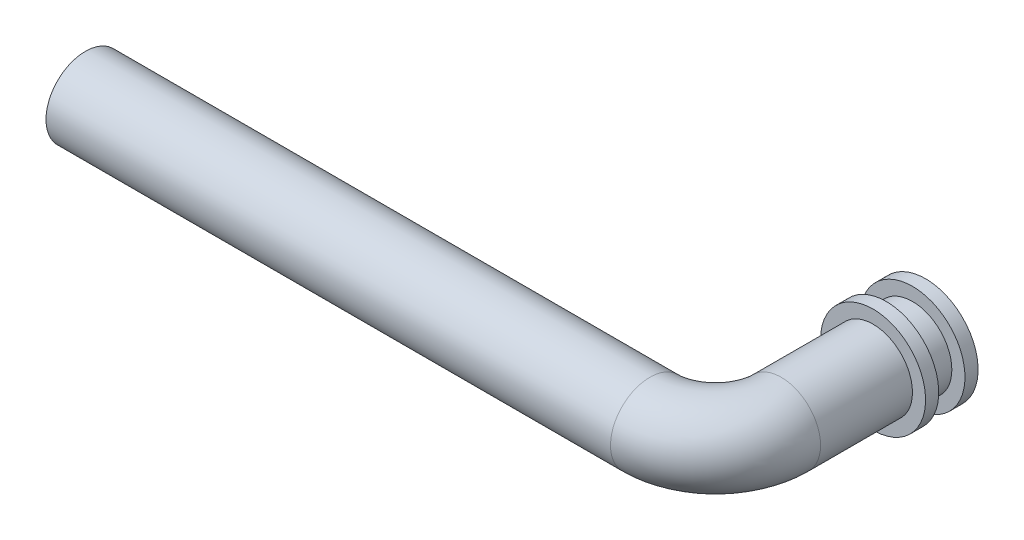
ISO-10303-21;
HEADER;
FILE_DESCRIPTION(('STEP AP214'),'2;1');
FILE_NAME('part.step','',(''),(''),'','','');
FILE_SCHEMA(('AUTOMOTIVE_DESIGN { 1 0 10303 214 1 1 1 1 }'));
ENDSEC;
DATA;
#1=APPLICATION_CONTEXT('core data for automotive mechanical design processes');
#2=APPLICATION_PROTOCOL_DEFINITION('international standard','automotive_design',2000,#1);
#3=PRODUCT_CONTEXT('',#1,'mechanical');
#4=PRODUCT('Part','Part','',(#3));
#5=PRODUCT_RELATED_PRODUCT_CATEGORY('part','',(#4));
#6=PRODUCT_DEFINITION_FORMATION('','',#4);
#7=PRODUCT_DEFINITION_CONTEXT('part definition',#1,'design');
#8=PRODUCT_DEFINITION('design','',#6,#7);
#9=PRODUCT_DEFINITION_SHAPE('','',#8);
#10=(LENGTH_UNIT() NAMED_UNIT(*) SI_UNIT(.MILLI.,.METRE.));
#11=(NAMED_UNIT(*) PLANE_ANGLE_UNIT() SI_UNIT($,.RADIAN.));
#12=(NAMED_UNIT(*) SI_UNIT($,.STERADIAN.) SOLID_ANGLE_UNIT());
#13=UNCERTAINTY_MEASURE_WITH_UNIT(LENGTH_MEASURE(1.E-05),#10,'distance_accuracy_value','');
#14=(GEOMETRIC_REPRESENTATION_CONTEXT(3) GLOBAL_UNCERTAINTY_ASSIGNED_CONTEXT((#13)) GLOBAL_UNIT_ASSIGNED_CONTEXT((#10,
#11,#12)) REPRESENTATION_CONTEXT('',''));
#15=CARTESIAN_POINT('',(0.,0.,0.));
#16=DIRECTION('',(0.,0.,1.));
#17=DIRECTION('',(1.,0.,0.));
#18=AXIS2_PLACEMENT_3D('',#15,#16,#17);
#19=CARTESIAN_POINT('',(0.,0.,0.));
#20=DIRECTION('',(0.,0.,1.));
#21=DIRECTION('',(1.,0.,0.));
#22=AXIS2_PLACEMENT_3D('',#19,#20,#21);
#23=CYLINDRICAL_SURFACE('',#22,6.);
#24=CARTESIAN_POINT('',(0.,0.,4.));
#25=DIRECTION('',(0.,0.,-1.));
#26=DIRECTION('',(-1.,0.,0.));
#27=AXIS2_PLACEMENT_3D('',#24,#25,#26);
#28=CIRCLE('',#27,6.);
#29=CARTESIAN_POINT('',(-6.,0.,4.));
#30=VERTEX_POINT('',#29);
#31=EDGE_CURVE('E13',#30,#30,#28,.F.);
#32=ORIENTED_EDGE('',*,*,#31,.F.);
#33=EDGE_LOOP('',(#32));
#34=FACE_BOUND('',#33,.T.);
#35=CARTESIAN_POINT('',(0.,0.,0.));
#36=DIRECTION('',(0.,0.,1.));
#37=DIRECTION('',(1.,0.,0.));
#38=AXIS2_PLACEMENT_3D('',#35,#36,#37);
#39=CIRCLE('',#38,6.);
#40=CARTESIAN_POINT('',(6.,0.,0.));
#41=VERTEX_POINT('',#40);
#42=EDGE_CURVE('E64',#41,#41,#39,.T.);
#43=ORIENTED_EDGE('',*,*,#42,.T.);
#44=EDGE_LOOP('',(#43));
#45=FACE_BOUND('',#44,.T.);
#46=ADVANCED_FACE('F45',(#34,#45),#23,.T.);
#47=CARTESIAN_POINT('',(0.,0.,-2.));
#48=DIRECTION('',(0.,0.,1.));
#49=DIRECTION('',(1.,0.,0.));
#50=AXIS2_PLACEMENT_3D('',#47,#48,#49);
#51=CYLINDRICAL_SURFACE('',#50,8.);
#52=CARTESIAN_POINT('',(0.,0.,-2.));
#53=DIRECTION('',(0.,0.,-1.));
#54=DIRECTION('',(-1.,0.,0.));
#55=AXIS2_PLACEMENT_3D('',#52,#53,#54);
#56=CIRCLE('',#55,8.);
#57=CARTESIAN_POINT('',(-8.,0.,-2.));
#58=VERTEX_POINT('',#57);
#59=EDGE_CURVE('E67',#58,#58,#56,.T.);
#60=ORIENTED_EDGE('',*,*,#59,.F.);
#61=EDGE_LOOP('',(#60));
#62=FACE_BOUND('',#61,.T.);
#63=CARTESIAN_POINT('',(0.,0.,0.));
#64=DIRECTION('',(0.,0.,-1.));
#65=DIRECTION('',(-1.,0.,0.));
#66=AXIS2_PLACEMENT_3D('',#63,#64,#65);
#67=CIRCLE('',#66,8.);
#68=CARTESIAN_POINT('',(-8.,0.,0.));
#69=VERTEX_POINT('',#68);
#70=EDGE_CURVE('E68',#69,#69,#67,.T.);
#71=ORIENTED_EDGE('',*,*,#70,.T.);
#72=EDGE_LOOP('',(#71));
#73=FACE_BOUND('',#72,.T.);
#74=ADVANCED_FACE('F99',(#62,#73),#51,.T.);
#75=CARTESIAN_POINT('',(0.,0.,-2.));
#76=DIRECTION('',(0.,0.,-1.));
#77=DIRECTION('',(-1.,0.,0.));
#78=AXIS2_PLACEMENT_3D('',#75,#76,#77);
#79=PLANE('',#78);
#80=ORIENTED_EDGE('',*,*,#59,.T.);
#81=EDGE_LOOP('',(#80));
#82=FACE_BOUND('',#81,.T.);
#83=ADVANCED_FACE('F104',(#82),#79,.T.);
#84=CARTESIAN_POINT('',(0.,0.,0.));
#85=DIRECTION('',(0.,0.,-1.));
#86=DIRECTION('',(-1.,0.,0.));
#87=AXIS2_PLACEMENT_3D('',#84,#85,#86);
#88=PLANE('',#87);
#89=ORIENTED_EDGE('',*,*,#42,.F.);
#90=EDGE_LOOP('',(#89));
#91=FACE_BOUND('',#90,.T.);
#92=ORIENTED_EDGE('',*,*,#70,.F.);
#93=EDGE_LOOP('',(#92));
#94=FACE_BOUND('',#93,.T.);
#95=ADVANCED_FACE('F110',(#91,#94),#88,.F.);
#96=CARTESIAN_POINT('',(0.,0.,4.));
#97=DIRECTION('',(0.,0.,-1.));
#98=DIRECTION('',(-1.,0.,0.));
#99=AXIS2_PLACEMENT_3D('',#96,#97,#98);
#100=PLANE('',#99);
#101=CARTESIAN_POINT('',(0.,0.,4.));
#102=DIRECTION('',(0.,0.,-1.));
#103=DIRECTION('',(-1.,0.,0.));
#104=AXIS2_PLACEMENT_3D('',#101,#102,#103);
#105=CIRCLE('',#104,8.);
#106=CARTESIAN_POINT('',(-8.,0.,4.));
#107=VERTEX_POINT('',#106);
#108=EDGE_CURVE('E71',#107,#107,#105,.T.);
#109=ORIENTED_EDGE('',*,*,#108,.T.);
#110=EDGE_LOOP('',(#109));
#111=FACE_BOUND('',#110,.T.);
#112=ORIENTED_EDGE('',*,*,#31,.T.);
#113=EDGE_LOOP('',(#112));
#114=FACE_BOUND('',#113,.T.);
#115=ADVANCED_FACE('F113',(#111,#114),#100,.T.);
#116=CARTESIAN_POINT('',(0.,0.,6.));
#117=DIRECTION('',(0.,0.,-1.));
#118=DIRECTION('',(-1.,0.,0.));
#119=AXIS2_PLACEMENT_3D('',#116,#117,#118);
#120=PLANE('',#119);
#121=CARTESIAN_POINT('',(0.,0.,6.));
#122=DIRECTION('',(0.,0.,-1.));
#123=DIRECTION('',(-1.,0.,0.));
#124=AXIS2_PLACEMENT_3D('',#121,#122,#123);
#125=CIRCLE('',#124,8.);
#126=CARTESIAN_POINT('',(-8.,0.,6.));
#127=VERTEX_POINT('',#126);
#128=EDGE_CURVE('E74',#127,#127,#125,.T.);
#129=ORIENTED_EDGE('',*,*,#128,.F.);
#130=EDGE_LOOP('',(#129));
#131=FACE_BOUND('',#130,.T.);
#132=CARTESIAN_POINT('',(0.,0.,6.));
#133=DIRECTION('',(0.,0.,-1.));
#134=DIRECTION('',(-1.,0.,0.));
#135=AXIS2_PLACEMENT_3D('',#132,#133,#134);
#136=CIRCLE('',#135,6.);
#137=CARTESIAN_POINT('',(-6.,0.,6.));
#138=VERTEX_POINT('',#137);
#139=EDGE_CURVE('E77',#138,#138,#136,.T.);
#140=ORIENTED_EDGE('',*,*,#139,.T.);
#141=EDGE_LOOP('',(#140));
#142=FACE_BOUND('',#141,.T.);
#143=ADVANCED_FACE('F83',(#131,#142),#120,.F.);
#144=CARTESIAN_POINT('',(0.,0.,4.));
#145=DIRECTION('',(0.,0.,1.));
#146=DIRECTION('',(1.,0.,0.));
#147=AXIS2_PLACEMENT_3D('',#144,#145,#146);
#148=CYLINDRICAL_SURFACE('',#147,8.);
#149=ORIENTED_EDGE('',*,*,#108,.F.);
#150=EDGE_LOOP('',(#149));
#151=FACE_BOUND('',#150,.T.);
#152=ORIENTED_EDGE('',*,*,#128,.T.);
#153=EDGE_LOOP('',(#152));
#154=FACE_BOUND('',#153,.T.);
#155=ADVANCED_FACE('F126',(#151,#154),#148,.T.);
#156=CARTESIAN_POINT('',(-96.,0.,30.));
#157=DIRECTION('',(-1.,0.,0.));
#158=DIRECTION('',(0.,0.,1.));
#159=AXIS2_PLACEMENT_3D('',#156,#157,#158);
#160=PLANE('',#159);
#161=CARTESIAN_POINT('',(-96.,0.,30.));
#162=DIRECTION('',(-1.,0.,0.));
#163=DIRECTION('',(0.,0.,1.));
#164=AXIS2_PLACEMENT_3D('',#161,#162,#163);
#165=CIRCLE('',#164,6.);
#166=CARTESIAN_POINT('',(-96.,0.,36.));
#167=VERTEX_POINT('',#166);
#168=EDGE_CURVE('E52',#167,#167,#165,.T.);
#169=ORIENTED_EDGE('',*,*,#168,.T.);
#170=EDGE_LOOP('',(#169));
#171=FACE_BOUND('',#170,.T.);
#172=ADVANCED_FACE('F47',(#171),#160,.T.);
#173=CARTESIAN_POINT('',(-10.,0.,30.));
#174=DIRECTION('',(-1.,0.,0.));
#175=DIRECTION('',(0.,0.,1.));
#176=AXIS2_PLACEMENT_3D('',#173,#174,#175);
#177=CYLINDRICAL_SURFACE('',#176,6.);
#178=ORIENTED_EDGE('',*,*,#168,.F.);
#179=EDGE_LOOP('',(#178));
#180=FACE_BOUND('',#179,.T.);
#181=CARTESIAN_POINT('',(-10.,0.,30.));
#182=DIRECTION('',(-1.,0.,0.));
#183=DIRECTION('',(0.,0.,1.));
#184=AXIS2_PLACEMENT_3D('',#181,#182,#183);
#185=CIRCLE('',#184,6.);
#186=CARTESIAN_POINT('',(-10.,0.,36.));
#187=VERTEX_POINT('',#186);
#188=EDGE_CURVE('E57',#187,#187,#185,.T.);
#189=ORIENTED_EDGE('',*,*,#188,.T.);
#190=EDGE_LOOP('',(#189));
#191=FACE_BOUND('',#190,.T.);
#192=ADVANCED_FACE('F93',(#180,#191),#177,.T.);
#193=CARTESIAN_POINT('',(-10.,0.,20.));
#194=DIRECTION('',(0.,-1.,0.));
#195=DIRECTION('',(1.,0.,0.));
#196=AXIS2_PLACEMENT_3D('',#193,#194,#195);
#197=TOROIDAL_SURFACE('',#196,10.,6.);
#198=CARTESIAN_POINT('',(0.,0.,20.));
#199=DIRECTION('',(0.,0.,1.));
#200=DIRECTION('',(1.,0.,0.));
#201=AXIS2_PLACEMENT_3D('',#198,#199,#200);
#202=CIRCLE('',#201,6.);
#203=CARTESIAN_POINT('',(6.,0.,20.));
#204=VERTEX_POINT('',#203);
#205=EDGE_CURVE('E59',#204,#204,#202,.T.);
#206=CARTESIAN_POINT('',(-10.,0.,20.));
#207=DIRECTION('',(0.,-1.,0.));
#208=DIRECTION('',(1.,0.,0.));
#209=AXIS2_PLACEMENT_3D('',#206,#207,#208);
#210=CIRCLE('',#209,16.);
#211=EDGE_CURVE('',#204,#187,#210,.T.);
#212=ORIENTED_EDGE('',*,*,#205,.T.);
#213=ORIENTED_EDGE('',*,*,#188,.F.);
#214=ORIENTED_EDGE('',*,*,#211,.T.);
#215=ORIENTED_EDGE('',*,*,#211,.F.);
#216=EDGE_LOOP('',(#212,#214,#213,#215));
#217=FACE_BOUND('',#216,.T.);
#218=ADVANCED_FACE('F87',(#217),#197,.T.);
#219=ORIENTED_EDGE('',*,*,#205,.F.);
#220=EDGE_LOOP('',(#219));
#221=FACE_BOUND('',#220,.T.);
#222=ORIENTED_EDGE('',*,*,#139,.F.);
#223=EDGE_LOOP('',(#222));
#224=FACE_BOUND('',#223,.T.);
#225=ADVANCED_FACE('F85',(#221,#224),#23,.T.);
#226=CLOSED_SHELL('',(#46,#74,#83,#95,#115,#143,#155,#172,#192,#218,#225));
#227=MANIFOLD_SOLID_BREP('B2',#226);
#228=ADVANCED_BREP_SHAPE_REPRESENTATION('',(#18,#227),#14);
#229=SHAPE_DEFINITION_REPRESENTATION(#9,#228);
ENDSEC;
END-ISO-10303-21;
